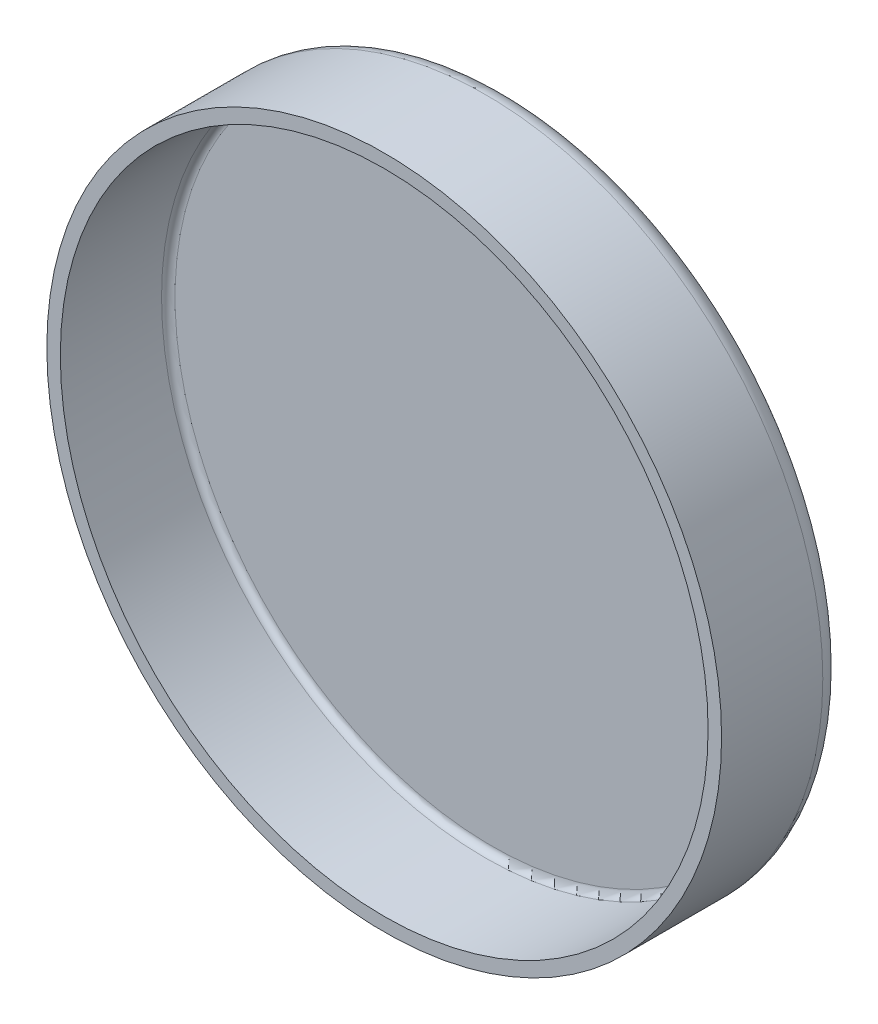
ISO-10303-21;
HEADER;
FILE_DESCRIPTION(('STEP AP214'),'2;1');
FILE_NAME('part.step','',(''),(''),'','','');
FILE_SCHEMA(('AUTOMOTIVE_DESIGN { 1 0 10303 214 1 1 1 1 }'));
ENDSEC;
DATA;
#1=APPLICATION_CONTEXT('core data for automotive mechanical design processes');
#2=APPLICATION_PROTOCOL_DEFINITION('international standard','automotive_design',2000,#1);
#3=PRODUCT_CONTEXT('',#1,'mechanical');
#4=PRODUCT('Part','Part','',(#3));
#5=PRODUCT_RELATED_PRODUCT_CATEGORY('part','',(#4));
#6=PRODUCT_DEFINITION_FORMATION('','',#4);
#7=PRODUCT_DEFINITION_CONTEXT('part definition',#1,'design');
#8=PRODUCT_DEFINITION('design','',#6,#7);
#9=PRODUCT_DEFINITION_SHAPE('','',#8);
#10=(LENGTH_UNIT() NAMED_UNIT(*) SI_UNIT(.MILLI.,.METRE.));
#11=(NAMED_UNIT(*) PLANE_ANGLE_UNIT() SI_UNIT($,.RADIAN.));
#12=(NAMED_UNIT(*) SI_UNIT($,.STERADIAN.) SOLID_ANGLE_UNIT());
#13=UNCERTAINTY_MEASURE_WITH_UNIT(LENGTH_MEASURE(1.E-05),#10,'distance_accuracy_value','');
#14=(GEOMETRIC_REPRESENTATION_CONTEXT(3) GLOBAL_UNCERTAINTY_ASSIGNED_CONTEXT((#13)) GLOBAL_UNIT_ASSIGNED_CONTEXT((#10,
#11,#12)) REPRESENTATION_CONTEXT('',''));
#15=CARTESIAN_POINT('',(0.,0.,0.));
#16=DIRECTION('',(0.,0.,1.));
#17=DIRECTION('',(1.,0.,0.));
#18=AXIS2_PLACEMENT_3D('',#15,#16,#17);
#19=CARTESIAN_POINT('',(0.,0.,9.));
#20=DIRECTION('',(0.,0.,-1.));
#21=DIRECTION('',(-1.,0.,0.));
#22=AXIS2_PLACEMENT_3D('',#19,#20,#21);
#23=CYLINDRICAL_SURFACE('',#22,25.);
#24=CARTESIAN_POINT('',(0.,0.,1.5));
#25=DIRECTION('',(0.,0.,1.));
#26=DIRECTION('',(1.,0.,0.));
#27=AXIS2_PLACEMENT_3D('',#24,#25,#26);
#28=CIRCLE('',#27,25.);
#29=CARTESIAN_POINT('',(25.,0.,1.5));
#30=VERTEX_POINT('',#29);
#31=EDGE_CURVE('E39',#30,#30,#28,.T.);
#32=ORIENTED_EDGE('',*,*,#31,.T.);
#33=EDGE_LOOP('',(#32));
#34=FACE_BOUND('',#33,.T.);
#35=CARTESIAN_POINT('',(0.,0.,9.));
#36=DIRECTION('',(0.,0.,1.));
#37=DIRECTION('',(1.,0.,0.));
#38=AXIS2_PLACEMENT_3D('',#35,#36,#37);
#39=CIRCLE('',#38,25.);
#40=CARTESIAN_POINT('',(25.,0.,9.));
#41=VERTEX_POINT('',#40);
#42=EDGE_CURVE('E52',#41,#41,#39,.T.);
#43=ORIENTED_EDGE('',*,*,#42,.F.);
#44=EDGE_LOOP('',(#43));
#45=FACE_BOUND('',#44,.T.);
#46=ADVANCED_FACE('F32',(#34,#45),#23,.T.);
#47=CARTESIAN_POINT('',(0.,0.,9.));
#48=DIRECTION('',(0.,0.,1.));
#49=DIRECTION('',(1.,0.,0.));
#50=AXIS2_PLACEMENT_3D('',#47,#48,#49);
#51=PLANE('',#50);
#52=CARTESIAN_POINT('',(0.,0.,9.));
#53=DIRECTION('',(0.,0.,1.));
#54=DIRECTION('',(1.,0.,0.));
#55=AXIS2_PLACEMENT_3D('',#52,#53,#54);
#56=CIRCLE('',#55,24.);
#57=CARTESIAN_POINT('',(24.,0.,9.));
#58=VERTEX_POINT('',#57);
#59=EDGE_CURVE('E55',#58,#58,#56,.T.);
#60=ORIENTED_EDGE('',*,*,#59,.F.);
#61=EDGE_LOOP('',(#60));
#62=FACE_BOUND('',#61,.T.);
#63=ORIENTED_EDGE('',*,*,#42,.T.);
#64=EDGE_LOOP('',(#63));
#65=FACE_BOUND('',#64,.T.);
#66=ADVANCED_FACE('F61',(#62,#65),#51,.T.);
#67=CARTESIAN_POINT('',(0.,0.,0.));
#68=DIRECTION('',(0.,0.,1.));
#69=DIRECTION('',(1.,0.,0.));
#70=AXIS2_PLACEMENT_3D('',#67,#68,#69);
#71=PLANE('',#70);
#72=CARTESIAN_POINT('',(0.,0.,0.));
#73=DIRECTION('',(0.,0.,1.));
#74=DIRECTION('',(1.,0.,0.));
#75=AXIS2_PLACEMENT_3D('',#72,#73,#74);
#76=CIRCLE('',#75,23.5);
#77=CARTESIAN_POINT('',(23.5,0.,0.));
#78=VERTEX_POINT('',#77);
#79=EDGE_CURVE('E10',#78,#78,#76,.F.);
#80=ORIENTED_EDGE('',*,*,#79,.T.);
#81=EDGE_LOOP('',(#80));
#82=FACE_BOUND('',#81,.T.);
#83=ADVANCED_FACE('F64',(#82),#71,.F.);
#84=CARTESIAN_POINT('',(0.,0.,9.));
#85=DIRECTION('',(0.,0.,-1.));
#86=DIRECTION('',(-1.,0.,0.));
#87=AXIS2_PLACEMENT_3D('',#84,#85,#86);
#88=CYLINDRICAL_SURFACE('',#87,24.);
#89=CARTESIAN_POINT('',(0.,0.,1.5));
#90=DIRECTION('',(0.,0.,1.));
#91=DIRECTION('',(1.,0.,0.));
#92=AXIS2_PLACEMENT_3D('',#89,#90,#91);
#93=CIRCLE('',#92,24.);
#94=CARTESIAN_POINT('',(24.,0.,1.5));
#95=VERTEX_POINT('',#94);
#96=EDGE_CURVE('E43',#95,#95,#93,.F.);
#97=ORIENTED_EDGE('',*,*,#96,.T.);
#98=EDGE_LOOP('',(#97));
#99=FACE_BOUND('',#98,.T.);
#100=ORIENTED_EDGE('',*,*,#59,.T.);
#101=EDGE_LOOP('',(#100));
#102=FACE_BOUND('',#101,.T.);
#103=ADVANCED_FACE('F59',(#99,#102),#88,.F.);
#104=CARTESIAN_POINT('',(0.,0.,1.));
#105=DIRECTION('',(0.,0.,1.));
#106=DIRECTION('',(1.,0.,0.));
#107=AXIS2_PLACEMENT_3D('',#104,#105,#106);
#108=PLANE('',#107);
#109=CARTESIAN_POINT('',(0.,0.,1.));
#110=DIRECTION('',(0.,0.,1.));
#111=DIRECTION('',(1.,0.,0.));
#112=AXIS2_PLACEMENT_3D('',#109,#110,#111);
#113=CIRCLE('',#112,23.5);
#114=CARTESIAN_POINT('',(23.5,0.,1.));
#115=VERTEX_POINT('',#114);
#116=EDGE_CURVE('E47',#115,#115,#113,.T.);
#117=ORIENTED_EDGE('',*,*,#116,.T.);
#118=EDGE_LOOP('',(#117));
#119=FACE_BOUND('',#118,.T.);
#120=ADVANCED_FACE('F75',(#119),#108,.T.);
#121=CARTESIAN_POINT('',(0.,0.,1.5));
#122=DIRECTION('',(0.,0.,1.));
#123=DIRECTION('',(1.,0.,0.));
#124=AXIS2_PLACEMENT_3D('',#121,#122,#123);
#125=TOROIDAL_SURFACE('',#124,23.5,0.5);
#126=ORIENTED_EDGE('',*,*,#96,.F.);
#127=EDGE_LOOP('',(#126));
#128=FACE_BOUND('',#127,.T.);
#129=ORIENTED_EDGE('',*,*,#116,.F.);
#130=EDGE_LOOP('',(#129));
#131=FACE_BOUND('',#130,.T.);
#132=ADVANCED_FACE('F73',(#128,#131),#125,.F.);
#133=CARTESIAN_POINT('',(0.,0.,1.5));
#134=DIRECTION('',(0.,0.,1.));
#135=DIRECTION('',(1.,0.,0.));
#136=AXIS2_PLACEMENT_3D('',#133,#134,#135);
#137=TOROIDAL_SURFACE('',#136,23.5,1.5);
#138=ORIENTED_EDGE('',*,*,#79,.F.);
#139=EDGE_LOOP('',(#138));
#140=FACE_BOUND('',#139,.T.);
#141=ORIENTED_EDGE('',*,*,#31,.F.);
#142=EDGE_LOOP('',(#141));
#143=FACE_BOUND('',#142,.T.);
#144=ADVANCED_FACE('F34',(#140,#143),#137,.T.);
#145=CLOSED_SHELL('',(#46,#66,#83,#103,#120,#132,#144));
#146=MANIFOLD_SOLID_BREP('B2',#145);
#147=ADVANCED_BREP_SHAPE_REPRESENTATION('',(#18,#146),#14);
#148=SHAPE_DEFINITION_REPRESENTATION(#9,#147);
ENDSEC;
END-ISO-10303-21;
